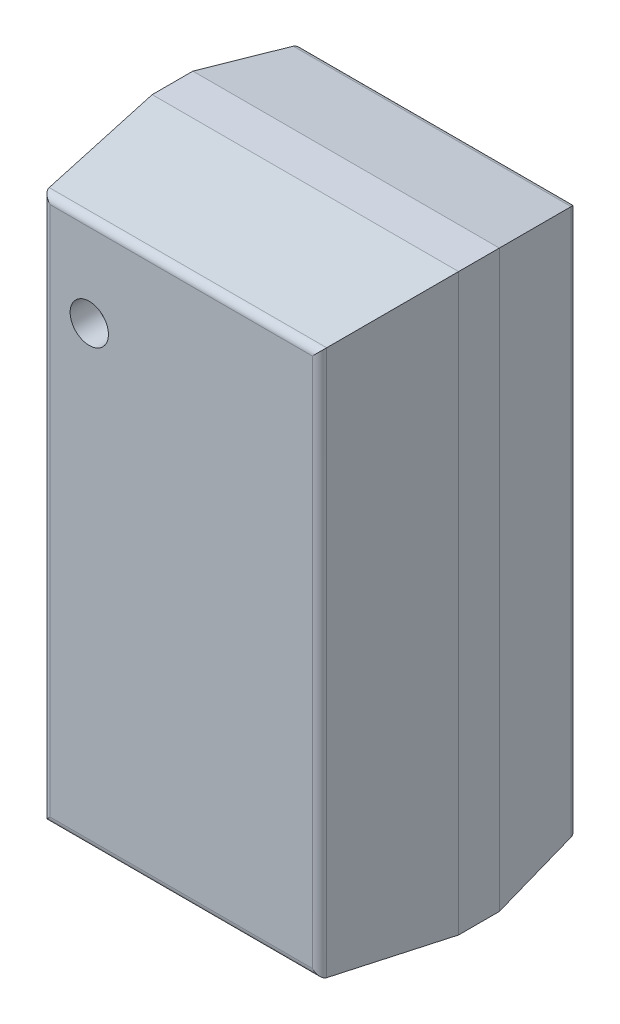
ISO-10303-21;
HEADER;
FILE_DESCRIPTION(('STEP AP214'),'2;1');
FILE_NAME('part.step','',(''),(''),'','','');
FILE_SCHEMA(('AUTOMOTIVE_DESIGN { 1 0 10303 214 1 1 1 1 }'));
ENDSEC;
DATA;
#1=APPLICATION_CONTEXT('core data for automotive mechanical design processes');
#2=APPLICATION_PROTOCOL_DEFINITION('international standard','automotive_design',2000,#1);
#3=PRODUCT_CONTEXT('',#1,'mechanical');
#4=PRODUCT('Part','Part','',(#3));
#5=PRODUCT_RELATED_PRODUCT_CATEGORY('part','',(#4));
#6=PRODUCT_DEFINITION_FORMATION('','',#4);
#7=PRODUCT_DEFINITION_CONTEXT('part definition',#1,'design');
#8=PRODUCT_DEFINITION('design','',#6,#7);
#9=PRODUCT_DEFINITION_SHAPE('','',#8);
#10=(LENGTH_UNIT() NAMED_UNIT(*) SI_UNIT(.MILLI.,.METRE.));
#11=(NAMED_UNIT(*) PLANE_ANGLE_UNIT() SI_UNIT($,.RADIAN.));
#12=(NAMED_UNIT(*) SI_UNIT($,.STERADIAN.) SOLID_ANGLE_UNIT());
#13=UNCERTAINTY_MEASURE_WITH_UNIT(LENGTH_MEASURE(1.E-05),#10,'distance_accuracy_value','');
#14=(GEOMETRIC_REPRESENTATION_CONTEXT(3) GLOBAL_UNCERTAINTY_ASSIGNED_CONTEXT((#13)) GLOBAL_UNIT_ASSIGNED_CONTEXT((#10,
#11,#12)) REPRESENTATION_CONTEXT('',''));
#15=CARTESIAN_POINT('',(0.,0.,0.));
#16=DIRECTION('',(0.,0.,1.));
#17=DIRECTION('',(1.,0.,0.));
#18=AXIS2_PLACEMENT_3D('',#15,#16,#17);
#19=CARTESIAN_POINT('',(-0.48,0.95,1.26));
#20=DIRECTION('',(0.,0.,1.));
#21=DIRECTION('',(1.,0.,0.));
#22=AXIS2_PLACEMENT_3D('',#19,#20,#21);
#23=PLANE('',#22);
#24=CARTESIAN_POINT('',(-0.48,0.95,1.26));
#25=DIRECTION('',(0.,0.,1.));
#26=DIRECTION('',(1.,0.,0.));
#27=AXIS2_PLACEMENT_3D('',#24,#25,#26);
#28=CIRCLE('',#27,0.1);
#29=CARTESIAN_POINT('',(-0.38,0.95,1.26));
#30=VERTEX_POINT('',#29);
#31=EDGE_CURVE('E20',#30,#30,#28,.T.);
#32=ORIENTED_EDGE('',*,*,#31,.T.);
#33=EDGE_LOOP('',(#32));
#34=FACE_BOUND('',#33,.T.);
#35=ADVANCED_FACE('F17',(#34),#23,.T.);
#36=CARTESIAN_POINT('',(-0.48,0.95,1.26));
#37=DIRECTION('',(0.,0.,1.));
#38=DIRECTION('',(1.,0.,0.));
#39=AXIS2_PLACEMENT_3D('',#36,#37,#38);
#40=CYLINDRICAL_SURFACE('',#39,0.1);
#41=CARTESIAN_POINT('',(-0.48,0.95,1.4));
#42=DIRECTION('',(0.,0.,1.));
#43=DIRECTION('',(1.,0.,0.));
#44=AXIS2_PLACEMENT_3D('',#41,#42,#43);
#45=CIRCLE('',#44,0.1);
#46=CARTESIAN_POINT('',(-0.38,0.95,1.4));
#47=VERTEX_POINT('',#46);
#48=EDGE_CURVE('E100',#47,#47,#45,.F.);
#49=ORIENTED_EDGE('',*,*,#48,.F.);
#50=EDGE_LOOP('',(#49));
#51=FACE_BOUND('',#50,.T.);
#52=ORIENTED_EDGE('',*,*,#31,.F.);
#53=EDGE_LOOP('',(#52));
#54=FACE_BOUND('',#53,.T.);
#55=ADVANCED_FACE('F496',(#51,#54),#40,.F.);
#56=CARTESIAN_POINT('',(-0.8,-1.5,1.4));
#57=DIRECTION('',(0.,0.,1.));
#58=DIRECTION('',(1.,0.,0.));
#59=AXIS2_PLACEMENT_3D('',#56,#57,#58);
#60=PLANE('',#59);
#61=ORIENTED_EDGE('',*,*,#48,.T.);
#62=EDGE_LOOP('',(#61));
#63=FACE_BOUND('',#62,.T.);
#64=DIRECTION('',(0.,1.,0.));
#65=VECTOR('',#64,1.);
#66=CARTESIAN_POINT('',(0.6846315109,-1.42,1.4));
#67=LINE('',#66,#65);
#68=CARTESIAN_POINT('',(0.6846315109,1.3846315109,1.4));
#69=VERTEX_POINT('',#68);
#70=CARTESIAN_POINT('',(0.6846315109,-1.3846315109,1.4));
#71=VERTEX_POINT('',#70);
#72=EDGE_CURVE('E107',#69,#71,#67,.F.);
#73=ORIENTED_EDGE('',*,*,#72,.F.);
#74=DIRECTION('',(1.,0.,0.));
#75=VECTOR('',#74,1.);
#76=CARTESIAN_POINT('',(-0.8,1.3846315109,1.4));
#77=LINE('',#76,#75);
#78=CARTESIAN_POINT('',(-0.6846315109,1.3846315109,1.4));
#79=VERTEX_POINT('',#78);
#80=EDGE_CURVE('E96',#69,#79,#77,.F.);
#81=ORIENTED_EDGE('',*,*,#80,.T.);
#82=DIRECTION('',(0.,1.,0.));
#83=VECTOR('',#82,1.);
#84=CARTESIAN_POINT('',(-0.6846315109,-1.42,1.4));
#85=LINE('',#84,#83);
#86=CARTESIAN_POINT('',(-0.6846315109,-1.3846315109,1.4));
#87=VERTEX_POINT('',#86);
#88=EDGE_CURVE('E92',#87,#79,#85,.T.);
#89=ORIENTED_EDGE('',*,*,#88,.F.);
#90=DIRECTION('',(1.,0.,0.));
#91=VECTOR('',#90,1.);
#92=CARTESIAN_POINT('',(-0.72,-1.3846315109,1.4));
#93=LINE('',#92,#91);
#94=EDGE_CURVE('E81',#71,#87,#93,.F.);
#95=ORIENTED_EDGE('',*,*,#94,.F.);
#96=EDGE_LOOP('',(#73,#81,#89,#95));
#97=FACE_BOUND('',#96,.T.);
#98=ADVANCED_FACE('F95',(#63,#97),#60,.T.);
#99=CARTESIAN_POINT('',(-0.6846315109,-1.42,1.36));
#100=DIRECTION('',(0.,1.,0.));
#101=DIRECTION('',(0.,0.,1.));
#102=AXIS2_PLACEMENT_3D('',#99,#100,#101);
#103=CYLINDRICAL_SURFACE('',#102,0.04);
#104=CARTESIAN_POINT('',(-0.6846315109,1.3846315109,1.36));
#105=DIRECTION('',(0.707106781186547,0.707106781186547,0.));
#106=DIRECTION('',(0.707106781186547,-0.707106781186547,0.));
#107=AXIS2_PLACEMENT_3D('',#104,#105,#106);
#108=ELLIPSE('',#107,0.0565685424949238,0.04);
#109=CARTESIAN_POINT('',(-0.724330543944768,1.4243305439446,1.36489762956209));
#110=VERTEX_POINT('',#109);
#111=EDGE_CURVE('E129',#110,#79,#108,.T.);
#112=ORIENTED_EDGE('',*,*,#111,.F.);
#113=DIRECTION('',(0.,1.,0.));
#114=VECTOR('',#113,1.);
#115=CARTESIAN_POINT('',(-0.724330543944664,-1.5,1.36489762956196));
#116=LINE('',#115,#114);
#117=CARTESIAN_POINT('',(-0.724330543944768,-1.4243305439446,1.36489762956209));
#118=VERTEX_POINT('',#117);
#119=EDGE_CURVE('E104',#110,#118,#116,.F.);
#120=ORIENTED_EDGE('',*,*,#119,.T.);
#121=CARTESIAN_POINT('',(-0.6846315109,-1.3846315109,1.36));
#122=DIRECTION('',(0.707106781186547,-0.707106781186547,0.));
#123=DIRECTION('',(0.707106781186547,0.707106781186547,0.));
#124=AXIS2_PLACEMENT_3D('',#121,#122,#123);
#125=ELLIPSE('',#124,0.0565685424949238,0.04);
#126=EDGE_CURVE('E86',#87,#118,#125,.T.);
#127=ORIENTED_EDGE('',*,*,#126,.F.);
#128=ORIENTED_EDGE('',*,*,#88,.T.);
#129=EDGE_LOOP('',(#112,#120,#127,#128));
#130=FACE_BOUND('',#129,.T.);
#131=ADVANCED_FACE('F103',(#130),#103,.T.);
#132=CARTESIAN_POINT('',(-0.72,-1.3846315109,1.36));
#133=DIRECTION('',(1.,0.,0.));
#134=DIRECTION('',(0.,0.,-1.));
#135=AXIS2_PLACEMENT_3D('',#132,#133,#134);
#136=CYLINDRICAL_SURFACE('',#135,0.04);
#137=ORIENTED_EDGE('',*,*,#94,.T.);
#138=ORIENTED_EDGE('',*,*,#126,.T.);
#139=DIRECTION('',(1.,0.,0.));
#140=VECTOR('',#139,1.);
#141=CARTESIAN_POINT('',(-0.8,-1.42433054394466,1.36489762956196));
#142=LINE('',#141,#140);
#143=CARTESIAN_POINT('',(0.7243305439446,-1.42433054394477,1.36489762956209));
#144=VERTEX_POINT('',#143);
#145=EDGE_CURVE('E141',#118,#144,#142,.T.);
#146=ORIENTED_EDGE('',*,*,#145,.T.);
#147=CARTESIAN_POINT('',(0.6846315109,-1.3846315109,1.36));
#148=DIRECTION('',(0.707106781186547,0.707106781186547,0.));
#149=DIRECTION('',(-0.707106781186547,0.707106781186547,0.));
#150=AXIS2_PLACEMENT_3D('',#147,#148,#149);
#151=ELLIPSE('',#150,0.0565685424949238,0.04);
#152=EDGE_CURVE('E88',#71,#144,#151,.T.);
#153=ORIENTED_EDGE('',*,*,#152,.F.);
#154=EDGE_LOOP('',(#137,#138,#146,#153));
#155=FACE_BOUND('',#154,.T.);
#156=ADVANCED_FACE('F83',(#155),#136,.T.);
#157=CARTESIAN_POINT('',(0.6846315109,-1.42,1.36));
#158=DIRECTION('',(0.,1.,0.));
#159=DIRECTION('',(0.,0.,1.));
#160=AXIS2_PLACEMENT_3D('',#157,#158,#159);
#161=CYLINDRICAL_SURFACE('',#160,0.04);
#162=CARTESIAN_POINT('',(0.6846315109,1.3846315109,1.36));
#163=DIRECTION('',(0.707106781186547,-0.707106781186547,0.));
#164=DIRECTION('',(0.707106781186547,0.707106781186547,0.));
#165=AXIS2_PLACEMENT_3D('',#162,#163,#164);
#166=ELLIPSE('',#165,0.0565685424949238,0.04);
#167=CARTESIAN_POINT('',(0.724330543944768,1.4243305439446,1.36489762956209));
#168=VERTEX_POINT('',#167);
#169=EDGE_CURVE('E130',#69,#168,#166,.F.);
#170=ORIENTED_EDGE('',*,*,#169,.F.);
#171=ORIENTED_EDGE('',*,*,#72,.T.);
#172=ORIENTED_EDGE('',*,*,#152,.T.);
#173=DIRECTION('',(0.,1.,0.));
#174=VECTOR('',#173,1.);
#175=CARTESIAN_POINT('',(0.724330543944664,-1.5,1.36489762956196));
#176=LINE('',#175,#174);
#177=EDGE_CURVE('E139',#168,#144,#176,.F.);
#178=ORIENTED_EDGE('',*,*,#177,.F.);
#179=EDGE_LOOP('',(#170,#171,#172,#178));
#180=FACE_BOUND('',#179,.T.);
#181=ADVANCED_FACE('F463',(#180),#161,.T.);
#182=CARTESIAN_POINT('',(-0.72,1.3846315109,1.36));
#183=DIRECTION('',(1.,0.,0.));
#184=DIRECTION('',(0.,0.,-1.));
#185=AXIS2_PLACEMENT_3D('',#182,#183,#184);
#186=CYLINDRICAL_SURFACE('',#185,0.04);
#187=DIRECTION('',(1.,0.,0.));
#188=VECTOR('',#187,1.);
#189=CARTESIAN_POINT('',(-0.8,1.42433054394466,1.36489762956196));
#190=LINE('',#189,#188);
#191=EDGE_CURVE('E149',#110,#168,#190,.T.);
#192=ORIENTED_EDGE('',*,*,#191,.F.);
#193=ORIENTED_EDGE('',*,*,#111,.T.);
#194=ORIENTED_EDGE('',*,*,#80,.F.);
#195=ORIENTED_EDGE('',*,*,#169,.T.);
#196=EDGE_LOOP('',(#192,#193,#194,#195));
#197=FACE_BOUND('',#196,.T.);
#198=ADVANCED_FACE('F453',(#197),#186,.T.);
#199=CARTESIAN_POINT('',(-0.76,-1.5,1.07576941016));
#200=DIRECTION('',(0.992475826113367,0.,-0.122440739056045));
#201=DIRECTION('',(-0.122440739056045,0.,-0.992475826113367));
#202=AXIS2_PLACEMENT_3D('',#199,#200,#201);
#203=PLANE('',#202);
#204=DIRECTION('',(0.121533131825082,-0.121533131825705,0.985118975422473));
#205=VECTOR('',#204,1.);
#206=CARTESIAN_POINT('',(-0.8,1.50000000000005,0.751538820320006));
#207=LINE('',#206,#205);
#208=CARTESIAN_POINT('',(-0.8,1.50000000000001,0.751538820320002));
#209=VERTEX_POINT('',#208);
#210=EDGE_CURVE('E155',#209,#110,#207,.T.);
#211=ORIENTED_EDGE('',*,*,#210,.F.);
#212=DIRECTION('',(0.,1.,0.));
#213=VECTOR('',#212,1.);
#214=CARTESIAN_POINT('',(-0.8,-1.5,0.75153882032));
#215=LINE('',#214,#213);
#216=CARTESIAN_POINT('',(-0.8,-1.50000000000001,0.751538820320002));
#217=VERTEX_POINT('',#216);
#218=EDGE_CURVE('E183',#209,#217,#215,.F.);
#219=ORIENTED_EDGE('',*,*,#218,.T.);
#220=DIRECTION('',(0.121533131825082,0.121533131825705,0.985118975422473));
#221=VECTOR('',#220,1.);
#222=CARTESIAN_POINT('',(-0.8,-1.50000000000005,0.751538820320006));
#223=LINE('',#222,#221);
#224=EDGE_CURVE('E142',#217,#118,#223,.T.);
#225=ORIENTED_EDGE('',*,*,#224,.T.);
#226=ORIENTED_EDGE('',*,*,#119,.F.);
#227=EDGE_LOOP('',(#211,#219,#225,#226));
#228=FACE_BOUND('',#227,.T.);
#229=ADVANCED_FACE('F444',(#228),#203,.F.);
#230=CARTESIAN_POINT('',(-0.8,-1.46,1.07576941016));
#231=DIRECTION('',(0.,0.992475826113367,-0.122440739056045));
#232=DIRECTION('',(0.,0.122440739056045,0.992475826113367));
#233=AXIS2_PLACEMENT_3D('',#230,#231,#232);
#234=PLANE('',#233);
#235=DIRECTION('',(1.,0.,0.));
#236=VECTOR('',#235,1.);
#237=CARTESIAN_POINT('',(-0.8,-1.5,0.75153882032));
#238=LINE('',#237,#236);
#239=CARTESIAN_POINT('',(0.800000000000013,-1.5,0.751538820320002));
#240=VERTEX_POINT('',#239);
#241=EDGE_CURVE('E170',#217,#240,#238,.T.);
#242=ORIENTED_EDGE('',*,*,#241,.T.);
#243=DIRECTION('',(0.121533131825705,-0.121533131825082,-0.985118975422473));
#244=VECTOR('',#243,1.);
#245=CARTESIAN_POINT('',(0.724330543944664,-1.424330543945,1.36489762956196));
#246=LINE('',#245,#244);
#247=EDGE_CURVE('E144',#144,#240,#246,.T.);
#248=ORIENTED_EDGE('',*,*,#247,.F.);
#249=ORIENTED_EDGE('',*,*,#145,.F.);
#250=ORIENTED_EDGE('',*,*,#224,.F.);
#251=EDGE_LOOP('',(#242,#248,#249,#250));
#252=FACE_BOUND('',#251,.T.);
#253=ADVANCED_FACE('F435',(#252),#234,.F.);
#254=CARTESIAN_POINT('',(0.76,-1.5,1.07576941016));
#255=DIRECTION('',(0.992475826113367,0.,0.122440739056045));
#256=DIRECTION('',(0.122440739056045,0.,-0.992475826113367));
#257=AXIS2_PLACEMENT_3D('',#254,#255,#256);
#258=PLANE('',#257);
#259=DIRECTION('',(0.121533131825082,0.121533131825705,-0.985118975422473));
#260=VECTOR('',#259,1.);
#261=CARTESIAN_POINT('',(0.724330543945,1.42433054394466,1.36489762956196));
#262=LINE('',#261,#260);
#263=CARTESIAN_POINT('',(0.8,1.50000000000001,0.751538820320002));
#264=VERTEX_POINT('',#263);
#265=EDGE_CURVE('E150',#168,#264,#262,.T.);
#266=ORIENTED_EDGE('',*,*,#265,.F.);
#267=ORIENTED_EDGE('',*,*,#177,.T.);
#268=ORIENTED_EDGE('',*,*,#247,.T.);
#269=DIRECTION('',(0.,1.,0.));
#270=VECTOR('',#269,1.);
#271=CARTESIAN_POINT('',(0.8,-1.5,0.75153882032));
#272=LINE('',#271,#270);
#273=EDGE_CURVE('E180',#264,#240,#272,.F.);
#274=ORIENTED_EDGE('',*,*,#273,.F.);
#275=EDGE_LOOP('',(#266,#267,#268,#274));
#276=FACE_BOUND('',#275,.T.);
#277=ADVANCED_FACE('F426',(#276),#258,.T.);
#278=CARTESIAN_POINT('',(-0.8,1.46,1.07576941016));
#279=DIRECTION('',(0.,0.992475826113367,0.122440739056045));
#280=DIRECTION('',(0.,-0.122440739056045,0.992475826113367));
#281=AXIS2_PLACEMENT_3D('',#278,#279,#280);
#282=PLANE('',#281);
#283=DIRECTION('',(1.,0.,0.));
#284=VECTOR('',#283,1.);
#285=CARTESIAN_POINT('',(-0.8,1.5,0.75153882032));
#286=LINE('',#285,#284);
#287=EDGE_CURVE('E202',#209,#264,#286,.T.);
#288=ORIENTED_EDGE('',*,*,#287,.F.);
#289=ORIENTED_EDGE('',*,*,#210,.T.);
#290=ORIENTED_EDGE('',*,*,#191,.T.);
#291=ORIENTED_EDGE('',*,*,#265,.T.);
#292=EDGE_LOOP('',(#288,#289,#290,#291));
#293=FACE_BOUND('',#292,.T.);
#294=ADVANCED_FACE('F417',(#293),#282,.T.);
#295=CARTESIAN_POINT('',(-0.8,-1.5,0.0565));
#296=DIRECTION('',(1.,0.,0.));
#297=DIRECTION('',(0.,0.,-1.));
#298=AXIS2_PLACEMENT_3D('',#295,#296,#297);
#299=PLANE('',#298);
#300=DIRECTION('',(0.,0.,1.));
#301=VECTOR('',#300,1.);
#302=CARTESIAN_POINT('',(-0.8,1.5,0.0565));
#303=LINE('',#302,#301);
#304=CARTESIAN_POINT('',(-0.79999999999997,1.49999999999991,0.539038820320015));
#305=VERTEX_POINT('',#304);
#306=EDGE_CURVE('E206',#305,#209,#303,.T.);
#307=ORIENTED_EDGE('',*,*,#306,.F.);
#308=DIRECTION('',(0.,1.,0.));
#309=VECTOR('',#308,1.);
#310=CARTESIAN_POINT('',(-0.79999999999988,-1.5,0.53903882032002));
#311=LINE('',#310,#309);
#312=CARTESIAN_POINT('',(-0.79999999999997,-1.49999999999994,0.539038820320015));
#313=VERTEX_POINT('',#312);
#314=EDGE_CURVE('E205',#313,#305,#311,.T.);
#315=ORIENTED_EDGE('',*,*,#314,.F.);
#316=DIRECTION('',(0.,0.,1.));
#317=VECTOR('',#316,1.);
#318=CARTESIAN_POINT('',(-0.8,-1.5,0.0565));
#319=LINE('',#318,#317);
#320=EDGE_CURVE('E173',#313,#217,#319,.T.);
#321=ORIENTED_EDGE('',*,*,#320,.T.);
#322=ORIENTED_EDGE('',*,*,#218,.F.);
#323=EDGE_LOOP('',(#307,#315,#321,#322));
#324=FACE_BOUND('',#323,.T.);
#325=ADVANCED_FACE('F407',(#324),#299,.F.);
#326=CARTESIAN_POINT('',(-0.8,-1.5,0.0565));
#327=DIRECTION('',(0.,1.,0.));
#328=DIRECTION('',(0.,0.,1.));
#329=AXIS2_PLACEMENT_3D('',#326,#327,#328);
#330=PLANE('',#329);
#331=ORIENTED_EDGE('',*,*,#320,.F.);
#332=DIRECTION('',(1.,0.,0.));
#333=VECTOR('',#332,1.);
#334=CARTESIAN_POINT('',(-0.8,-1.49999999999988,0.53903882032002));
#335=LINE('',#334,#333);
#336=CARTESIAN_POINT('',(0.799999999999941,-1.49999999999997,0.53903882032002));
#337=VERTEX_POINT('',#336);
#338=EDGE_CURVE('E235',#337,#313,#335,.F.);
#339=ORIENTED_EDGE('',*,*,#338,.F.);
#340=DIRECTION('',(0.,0.,-1.));
#341=VECTOR('',#340,1.);
#342=CARTESIAN_POINT('',(0.8,-1.5,0.0565));
#343=LINE('',#342,#341);
#344=EDGE_CURVE('E172',#240,#337,#343,.T.);
#345=ORIENTED_EDGE('',*,*,#344,.F.);
#346=ORIENTED_EDGE('',*,*,#241,.F.);
#347=EDGE_LOOP('',(#331,#339,#345,#346));
#348=FACE_BOUND('',#347,.T.);
#349=ADVANCED_FACE('F398',(#348),#330,.F.);
#350=CARTESIAN_POINT('',(0.8,-1.5,0.0565));
#351=DIRECTION('',(1.,0.,0.));
#352=DIRECTION('',(0.,0.,-1.));
#353=AXIS2_PLACEMENT_3D('',#350,#351,#352);
#354=PLANE('',#353);
#355=DIRECTION('',(0.,0.,1.));
#356=VECTOR('',#355,1.);
#357=CARTESIAN_POINT('',(0.8,1.5,0.0565));
#358=LINE('',#357,#356);
#359=CARTESIAN_POINT('',(0.799999999999971,1.49999999999994,0.53903882032002));
#360=VERTEX_POINT('',#359);
#361=EDGE_CURVE('E210',#264,#360,#358,.F.);
#362=ORIENTED_EDGE('',*,*,#361,.F.);
#363=ORIENTED_EDGE('',*,*,#273,.T.);
#364=ORIENTED_EDGE('',*,*,#344,.T.);
#365=DIRECTION('',(0.,1.,0.));
#366=VECTOR('',#365,1.);
#367=CARTESIAN_POINT('',(0.79999999999988,-1.5,0.53903882032002));
#368=LINE('',#367,#366);
#369=EDGE_CURVE('E228',#337,#360,#368,.T.);
#370=ORIENTED_EDGE('',*,*,#369,.T.);
#371=EDGE_LOOP('',(#362,#363,#364,#370));
#372=FACE_BOUND('',#371,.T.);
#373=ADVANCED_FACE('F389',(#372),#354,.T.);
#374=CARTESIAN_POINT('',(-0.8,1.5,0.0565));
#375=DIRECTION('',(0.,1.,0.));
#376=DIRECTION('',(0.,0.,1.));
#377=AXIS2_PLACEMENT_3D('',#374,#375,#376);
#378=PLANE('',#377);
#379=ORIENTED_EDGE('',*,*,#306,.T.);
#380=ORIENTED_EDGE('',*,*,#287,.T.);
#381=ORIENTED_EDGE('',*,*,#361,.T.);
#382=DIRECTION('',(1.,0.,0.));
#383=VECTOR('',#382,1.);
#384=CARTESIAN_POINT('',(-0.8,1.49999999999988,0.53903882032002));
#385=LINE('',#384,#383);
#386=EDGE_CURVE('E254',#360,#305,#385,.F.);
#387=ORIENTED_EDGE('',*,*,#386,.T.);
#388=EDGE_LOOP('',(#379,#380,#381,#387));
#389=FACE_BOUND('',#388,.T.);
#390=ADVANCED_FACE('F380',(#389),#378,.T.);
#391=CARTESIAN_POINT('',(-0.76,-1.5,0.29776941016));
#392=DIRECTION('',(-0.986533849302465,0.,-0.163557219897077));
#393=DIRECTION('',(-0.163557219897077,0.,0.986533849302465));
#394=AXIS2_PLACEMENT_3D('',#391,#392,#393);
#395=PLANE('',#394);
#396=DIRECTION('',(0.161412498591012,-0.161412498591174,-0.973597458191608));
#397=VECTOR('',#396,1.);
#398=CARTESIAN_POINT('',(-0.8,1.49999999999988,0.53903882032002));
#399=LINE('',#398,#397);
#400=CARTESIAN_POINT('',(-0.725546946243071,1.42554694624295,0.0899577112041064));
#401=VERTEX_POINT('',#400);
#402=EDGE_CURVE('E256',#305,#401,#399,.T.);
#403=ORIENTED_EDGE('',*,*,#402,.T.);
#404=DIRECTION('',(0.,1.,0.));
#405=VECTOR('',#404,1.);
#406=CARTESIAN_POINT('',(-0.725546946243093,-1.42,0.0899577112040845));
#407=LINE('',#406,#405);
#408=CARTESIAN_POINT('',(-0.725546946243071,-1.42554694624295,0.0899577112041064));
#409=VERTEX_POINT('',#408);
#410=EDGE_CURVE('E128',#409,#401,#407,.T.);
#411=ORIENTED_EDGE('',*,*,#410,.F.);
#412=DIRECTION('',(0.161412498591012,0.161412498591174,-0.973597458191608));
#413=VECTOR('',#412,1.);
#414=CARTESIAN_POINT('',(-0.8,-1.49999999999988,0.53903882032002));
#415=LINE('',#414,#413);
#416=EDGE_CURVE('E237',#313,#409,#415,.T.);
#417=ORIENTED_EDGE('',*,*,#416,.F.);
#418=ORIENTED_EDGE('',*,*,#314,.T.);
#419=EDGE_LOOP('',(#403,#411,#417,#418));
#420=FACE_BOUND('',#419,.T.);
#421=ADVANCED_FACE('F301',(#420),#395,.T.);
#422=CARTESIAN_POINT('',(-0.8,-1.46,0.29776941016));
#423=DIRECTION('',(0.,-0.986533849302465,-0.163557219897077));
#424=DIRECTION('',(0.,0.163557219897077,-0.986533849302465));
#425=AXIS2_PLACEMENT_3D('',#422,#423,#424);
#426=PLANE('',#425);
#427=ORIENTED_EDGE('',*,*,#338,.T.);
#428=ORIENTED_EDGE('',*,*,#416,.T.);
#429=DIRECTION('',(1.,0.,0.));
#430=VECTOR('',#429,1.);
#431=CARTESIAN_POINT('',(-0.72,-1.42554694624309,0.0899577112040845));
#432=LINE('',#431,#430);
#433=CARTESIAN_POINT('',(0.72554694624295,-1.42554694624307,0.0899577112041064));
#434=VERTEX_POINT('',#433);
#435=EDGE_CURVE('E127',#434,#409,#432,.F.);
#436=ORIENTED_EDGE('',*,*,#435,.F.);
#437=DIRECTION('',(0.161412498591174,-0.161412498591012,0.973597458191608));
#438=VECTOR('',#437,1.);
#439=CARTESIAN_POINT('',(0.725546946242805,-1.425546946243,0.0899577112041322));
#440=LINE('',#439,#438);
#441=EDGE_CURVE('E231',#434,#337,#440,.T.);
#442=ORIENTED_EDGE('',*,*,#441,.T.);
#443=EDGE_LOOP('',(#427,#428,#436,#442));
#444=FACE_BOUND('',#443,.T.);
#445=ADVANCED_FACE('F275',(#444),#426,.T.);
#446=CARTESIAN_POINT('',(0.76,-1.5,0.29776941016));
#447=DIRECTION('',(-0.986533849302465,0.,0.163557219897077));
#448=DIRECTION('',(0.163557219897077,0.,0.986533849302465));
#449=AXIS2_PLACEMENT_3D('',#446,#447,#448);
#450=PLANE('',#449);
#451=DIRECTION('',(0.161412498591012,0.161412498591174,0.973597458191608));
#452=VECTOR('',#451,1.);
#453=CARTESIAN_POINT('',(0.725546946243001,1.42554694624281,0.0899577112041322));
#454=LINE('',#453,#452);
#455=CARTESIAN_POINT('',(0.725546946243072,1.42554694624295,0.0899577112041064));
#456=VERTEX_POINT('',#455);
#457=EDGE_CURVE('E230',#456,#360,#454,.T.);
#458=ORIENTED_EDGE('',*,*,#457,.T.);
#459=ORIENTED_EDGE('',*,*,#369,.F.);
#460=ORIENTED_EDGE('',*,*,#441,.F.);
#461=DIRECTION('',(0.,1.,0.));
#462=VECTOR('',#461,1.);
#463=CARTESIAN_POINT('',(0.725546946243093,-1.42,0.0899577112040845));
#464=LINE('',#463,#462);
#465=EDGE_CURVE('E124',#456,#434,#464,.F.);
#466=ORIENTED_EDGE('',*,*,#465,.F.);
#467=EDGE_LOOP('',(#458,#459,#460,#466));
#468=FACE_BOUND('',#467,.T.);
#469=ADVANCED_FACE('F280',(#468),#450,.F.);
#470=CARTESIAN_POINT('',(-0.8,1.46,0.29776941016));
#471=DIRECTION('',(0.,-0.986533849302465,0.163557219897077));
#472=DIRECTION('',(0.,-0.163557219897077,-0.986533849302465));
#473=AXIS2_PLACEMENT_3D('',#470,#471,#472);
#474=PLANE('',#473);
#475=ORIENTED_EDGE('',*,*,#386,.F.);
#476=ORIENTED_EDGE('',*,*,#457,.F.);
#477=DIRECTION('',(1.,0.,0.));
#478=VECTOR('',#477,1.);
#479=CARTESIAN_POINT('',(-0.72,1.42554694624309,0.0899577112040845));
#480=LINE('',#479,#478);
#481=EDGE_CURVE('E118',#401,#456,#480,.T.);
#482=ORIENTED_EDGE('',*,*,#481,.F.);
#483=ORIENTED_EDGE('',*,*,#402,.F.);
#484=EDGE_LOOP('',(#475,#476,#482,#483));
#485=FACE_BOUND('',#484,.T.);
#486=ADVANCED_FACE('F303',(#485),#474,.F.);
#487=CARTESIAN_POINT('',(-0.686085592271,-1.42,0.0965));
#488=DIRECTION('',(0.,1.,0.));
#489=DIRECTION('',(0.,0.,1.));
#490=AXIS2_PLACEMENT_3D('',#487,#488,#489);
#491=CYLINDRICAL_SURFACE('',#490,0.04);
#492=DIRECTION('',(0.,1.,0.));
#493=VECTOR('',#492,1.);
#494=CARTESIAN_POINT('',(-0.686085592271,-1.5,0.0565));
#495=LINE('',#494,#493);
#496=CARTESIAN_POINT('',(-0.686085592271,1.386085592271,0.0565));
#497=VERTEX_POINT('',#496);
#498=CARTESIAN_POINT('',(-0.686085592271,-1.386085592271,0.0565));
#499=VERTEX_POINT('',#498);
#500=EDGE_CURVE('E117',#497,#499,#495,.F.);
#501=ORIENTED_EDGE('',*,*,#500,.T.);
#502=CARTESIAN_POINT('',(-0.686085592271,-1.386085592271,0.0965));
#503=DIRECTION('',(0.707106781186547,-0.707106781186547,0.));
#504=DIRECTION('',(0.707106781186547,0.707106781186547,0.));
#505=AXIS2_PLACEMENT_3D('',#502,#503,#504);
#506=ELLIPSE('',#505,0.0565685424949238,0.04);
#507=EDGE_CURVE('E125',#409,#499,#506,.T.);
#508=ORIENTED_EDGE('',*,*,#507,.F.);
#509=ORIENTED_EDGE('',*,*,#410,.T.);
#510=CARTESIAN_POINT('',(-0.686085592271,1.386085592271,0.0965));
#511=DIRECTION('',(0.707106781186547,0.707106781186547,0.));
#512=DIRECTION('',(0.707106781186547,-0.707106781186547,0.));
#513=AXIS2_PLACEMENT_3D('',#510,#511,#512);
#514=ELLIPSE('',#513,0.0565685424949238,0.04);
#515=EDGE_CURVE('E119',#497,#401,#514,.T.);
#516=ORIENTED_EDGE('',*,*,#515,.F.);
#517=EDGE_LOOP('',(#501,#508,#509,#516));
#518=FACE_BOUND('',#517,.T.);
#519=ADVANCED_FACE('F297',(#518),#491,.T.);
#520=CARTESIAN_POINT('',(-0.72,-1.386085592271,0.0965));
#521=DIRECTION('',(1.,0.,0.));
#522=DIRECTION('',(0.,0.,-1.));
#523=AXIS2_PLACEMENT_3D('',#520,#521,#522);
#524=CYLINDRICAL_SURFACE('',#523,0.04);
#525=CARTESIAN_POINT('',(0.686085592271,-1.386085592271,0.0965));
#526=DIRECTION('',(0.707106781186547,0.707106781186547,0.));
#527=DIRECTION('',(-0.707106781186547,0.707106781186547,0.));
#528=AXIS2_PLACEMENT_3D('',#525,#526,#527);
#529=ELLIPSE('',#528,0.0565685424949238,0.04);
#530=CARTESIAN_POINT('',(0.686085592271,-1.386085592271,0.0565));
#531=VERTEX_POINT('',#530);
#532=EDGE_CURVE('E122',#434,#531,#529,.T.);
#533=ORIENTED_EDGE('',*,*,#532,.F.);
#534=ORIENTED_EDGE('',*,*,#435,.T.);
#535=ORIENTED_EDGE('',*,*,#507,.T.);
#536=DIRECTION('',(1.,0.,0.));
#537=VECTOR('',#536,1.);
#538=CARTESIAN_POINT('',(-0.8,-1.386085592271,0.0565));
#539=LINE('',#538,#537);
#540=EDGE_CURVE('E289',#499,#531,#539,.T.);
#541=ORIENTED_EDGE('',*,*,#540,.T.);
#542=EDGE_LOOP('',(#533,#534,#535,#541));
#543=FACE_BOUND('',#542,.T.);
#544=ADVANCED_FACE('F310',(#543),#524,.T.);
#545=CARTESIAN_POINT('',(0.686085592271,-1.42,0.0965));
#546=DIRECTION('',(0.,1.,0.));
#547=DIRECTION('',(0.,0.,1.));
#548=AXIS2_PLACEMENT_3D('',#545,#546,#547);
#549=CYLINDRICAL_SURFACE('',#548,0.04);
#550=ORIENTED_EDGE('',*,*,#465,.T.);
#551=ORIENTED_EDGE('',*,*,#532,.T.);
#552=DIRECTION('',(0.,1.,0.));
#553=VECTOR('',#552,1.);
#554=CARTESIAN_POINT('',(0.686085592271,-1.5,0.0565));
#555=LINE('',#554,#553);
#556=CARTESIAN_POINT('',(0.686085592271,1.386085592271,0.0565));
#557=VERTEX_POINT('',#556);
#558=EDGE_CURVE('E26',#531,#557,#555,.T.);
#559=ORIENTED_EDGE('',*,*,#558,.T.);
#560=CARTESIAN_POINT('',(0.686085592271,1.386085592271,0.0965));
#561=DIRECTION('',(0.707106781186547,-0.707106781186547,0.));
#562=DIRECTION('',(0.707106781186547,0.707106781186547,0.));
#563=AXIS2_PLACEMENT_3D('',#560,#561,#562);
#564=ELLIPSE('',#563,0.0565685424949238,0.04);
#565=EDGE_CURVE('E34',#456,#557,#564,.F.);
#566=ORIENTED_EDGE('',*,*,#565,.F.);
#567=EDGE_LOOP('',(#550,#551,#559,#566));
#568=FACE_BOUND('',#567,.T.);
#569=ADVANCED_FACE('F282',(#568),#549,.T.);
#570=CARTESIAN_POINT('',(-0.72,1.386085592271,0.0965));
#571=DIRECTION('',(1.,0.,0.));
#572=DIRECTION('',(0.,0.,-1.));
#573=AXIS2_PLACEMENT_3D('',#570,#571,#572);
#574=CYLINDRICAL_SURFACE('',#573,0.04);
#575=ORIENTED_EDGE('',*,*,#565,.T.);
#576=DIRECTION('',(1.,0.,0.));
#577=VECTOR('',#576,1.);
#578=CARTESIAN_POINT('',(-0.8,1.386085592271,0.0565));
#579=LINE('',#578,#577);
#580=EDGE_CURVE('E11',#557,#497,#579,.F.);
#581=ORIENTED_EDGE('',*,*,#580,.T.);
#582=ORIENTED_EDGE('',*,*,#515,.T.);
#583=ORIENTED_EDGE('',*,*,#481,.T.);
#584=EDGE_LOOP('',(#575,#581,#582,#583));
#585=FACE_BOUND('',#584,.T.);
#586=ADVANCED_FACE('F298',(#585),#574,.T.);
#587=CARTESIAN_POINT('',(-0.8,-1.5,0.0565));
#588=DIRECTION('',(0.,0.,1.));
#589=DIRECTION('',(1.,0.,0.));
#590=AXIS2_PLACEMENT_3D('',#587,#588,#589);
#591=PLANE('',#590);
#592=ORIENTED_EDGE('',*,*,#558,.F.);
#593=ORIENTED_EDGE('',*,*,#540,.F.);
#594=ORIENTED_EDGE('',*,*,#500,.F.);
#595=ORIENTED_EDGE('',*,*,#580,.F.);
#596=EDGE_LOOP('',(#592,#593,#594,#595));
#597=FACE_BOUND('',#596,.T.);
#598=ADVANCED_FACE('F308',(#597),#591,.F.);
#599=CLOSED_SHELL('',(#35,#55,#98,#131,#156,#181,#198,#229,#253,#277,#294,#325,#349,#373,#390,
#421,#445,#469,#486,#519,#544,#569,#586,#598));
#600=MANIFOLD_SOLID_BREP('B1',#599);
#601=ADVANCED_BREP_SHAPE_REPRESENTATION('',(#18,#600),#14);
#602=SHAPE_DEFINITION_REPRESENTATION(#9,#601);
ENDSEC;
END-ISO-10303-21;
